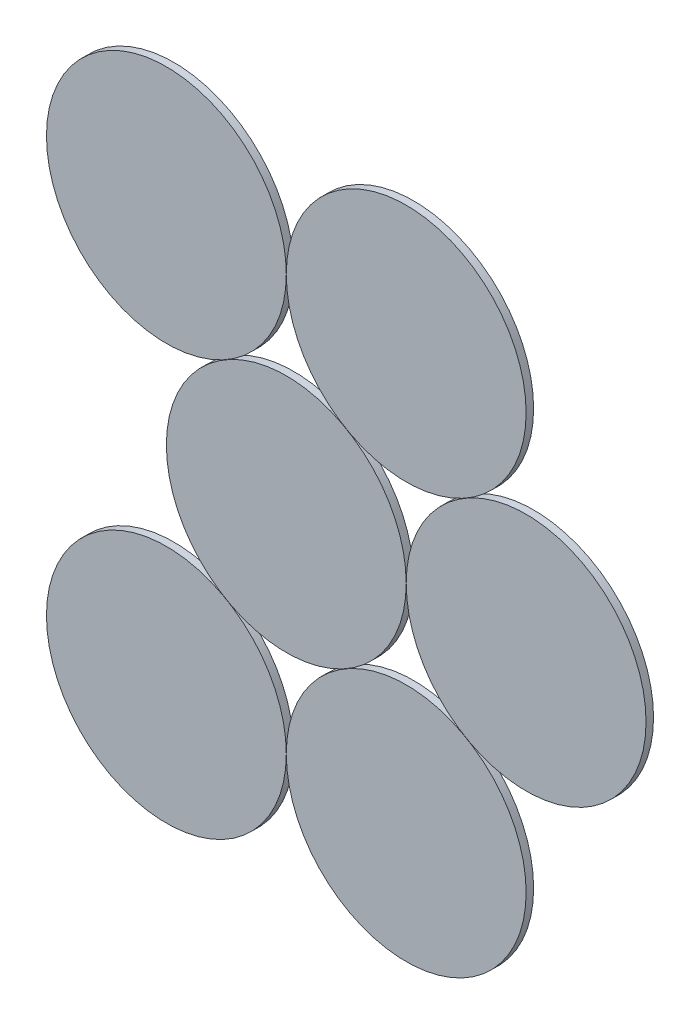
ISO-10303-21;
HEADER;
FILE_DESCRIPTION(('STEP AP214'),'2;1');
FILE_NAME('part.step','',(''),(''),'','','');
FILE_SCHEMA(('AUTOMOTIVE_DESIGN { 1 0 10303 214 1 1 1 1 }'));
ENDSEC;
DATA;
#1=APPLICATION_CONTEXT('core data for automotive mechanical design processes');
#2=APPLICATION_PROTOCOL_DEFINITION('international standard','automotive_design',2000,#1);
#3=PRODUCT_CONTEXT('',#1,'mechanical');
#4=PRODUCT('Part','Part','',(#3));
#5=PRODUCT_RELATED_PRODUCT_CATEGORY('part','',(#4));
#6=PRODUCT_DEFINITION_FORMATION('','',#4);
#7=PRODUCT_DEFINITION_CONTEXT('part definition',#1,'design');
#8=PRODUCT_DEFINITION('design','',#6,#7);
#9=PRODUCT_DEFINITION_SHAPE('','',#8);
#10=(LENGTH_UNIT() NAMED_UNIT(*) SI_UNIT(.MILLI.,.METRE.));
#11=(NAMED_UNIT(*) PLANE_ANGLE_UNIT() SI_UNIT($,.RADIAN.));
#12=(NAMED_UNIT(*) SI_UNIT($,.STERADIAN.) SOLID_ANGLE_UNIT());
#13=UNCERTAINTY_MEASURE_WITH_UNIT(LENGTH_MEASURE(1.E-05),#10,'distance_accuracy_value','');
#14=(GEOMETRIC_REPRESENTATION_CONTEXT(3) GLOBAL_UNCERTAINTY_ASSIGNED_CONTEXT((#13)) GLOBAL_UNIT_ASSIGNED_CONTEXT((#10,
#11,#12)) REPRESENTATION_CONTEXT('',''));
#15=CARTESIAN_POINT('',(0.,0.,0.));
#16=DIRECTION('',(0.,0.,1.));
#17=DIRECTION('',(1.,0.,0.));
#18=AXIS2_PLACEMENT_3D('',#15,#16,#17);
#19=CARTESIAN_POINT('',(152.4,-87.988181024499,3.175));
#20=DIRECTION('',(0.,0.,-1.));
#21=DIRECTION('',(-1.,0.,0.));
#22=AXIS2_PLACEMENT_3D('',#19,#20,#21);
#23=CYLINDRICAL_SURFACE('',#22,50.8);
#24=CARTESIAN_POINT('',(152.4,-87.988181024499,3.175));
#25=DIRECTION('',(0.,0.,1.));
#26=DIRECTION('',(1.,0.,0.));
#27=AXIS2_PLACEMENT_3D('',#24,#25,#26);
#28=CIRCLE('',#27,50.8);
#29=CARTESIAN_POINT('',(203.2,-87.988181024499,3.175));
#30=VERTEX_POINT('',#29);
#31=EDGE_CURVE('E12',#30,#30,#28,.T.);
#32=ORIENTED_EDGE('',*,*,#31,.F.);
#33=EDGE_LOOP('',(#32));
#34=FACE_BOUND('',#33,.T.);
#35=CARTESIAN_POINT('',(152.4,-87.988181024499,0.));
#36=DIRECTION('',(0.,0.,1.));
#37=DIRECTION('',(1.,0.,0.));
#38=AXIS2_PLACEMENT_3D('',#35,#36,#37);
#39=CIRCLE('',#38,50.8);
#40=CARTESIAN_POINT('',(203.2,-87.988181024499,0.));
#41=VERTEX_POINT('',#40);
#42=EDGE_CURVE('E52',#41,#41,#39,.T.);
#43=ORIENTED_EDGE('',*,*,#42,.T.);
#44=EDGE_LOOP('',(#43));
#45=FACE_BOUND('',#44,.T.);
#46=ADVANCED_FACE('F49',(#34,#45),#23,.T.);
#47=CARTESIAN_POINT('',(152.4,-87.988181024499,3.175));
#48=DIRECTION('',(0.,0.,1.));
#49=DIRECTION('',(1.,0.,0.));
#50=AXIS2_PLACEMENT_3D('',#47,#48,#49);
#51=PLANE('',#50);
#52=ORIENTED_EDGE('',*,*,#31,.T.);
#53=EDGE_LOOP('',(#52));
#54=FACE_BOUND('',#53,.T.);
#55=ADVANCED_FACE('F65',(#54),#51,.T.);
#56=CARTESIAN_POINT('',(152.4,-87.988181024499,0.));
#57=DIRECTION('',(0.,0.,1.));
#58=DIRECTION('',(1.,0.,0.));
#59=AXIS2_PLACEMENT_3D('',#56,#57,#58);
#60=PLANE('',#59);
#61=ORIENTED_EDGE('',*,*,#42,.F.);
#62=EDGE_LOOP('',(#61));
#63=FACE_BOUND('',#62,.T.);
#64=ADVANCED_FACE('F63',(#63),#60,.F.);
#65=CLOSED_SHELL('',(#46,#55,#64));
#66=MANIFOLD_SOLID_BREP('B2',#65);
#67=CARTESIAN_POINT('',(101.6,-175.976362048998,3.175));
#68=DIRECTION('',(0.,0.,-1.));
#69=DIRECTION('',(-1.,0.,0.));
#70=AXIS2_PLACEMENT_3D('',#67,#68,#69);
#71=CYLINDRICAL_SURFACE('',#70,50.8);
#72=CARTESIAN_POINT('',(101.6,-175.976362048998,3.175));
#73=DIRECTION('',(0.,0.,1.));
#74=DIRECTION('',(1.,0.,0.));
#75=AXIS2_PLACEMENT_3D('',#72,#73,#74);
#76=CIRCLE('',#75,50.8);
#77=CARTESIAN_POINT('',(152.4,-175.976362048998,3.175));
#78=VERTEX_POINT('',#77);
#79=EDGE_CURVE('E48',#78,#78,#76,.T.);
#80=ORIENTED_EDGE('',*,*,#79,.F.);
#81=EDGE_LOOP('',(#80));
#82=FACE_BOUND('',#81,.T.);
#83=CARTESIAN_POINT('',(101.6,-175.976362048998,0.));
#84=DIRECTION('',(0.,0.,1.));
#85=DIRECTION('',(1.,0.,0.));
#86=AXIS2_PLACEMENT_3D('',#83,#84,#85);
#87=CIRCLE('',#86,50.8);
#88=CARTESIAN_POINT('',(152.4,-175.976362048998,0.));
#89=VERTEX_POINT('',#88);
#90=EDGE_CURVE('E104',#89,#89,#87,.T.);
#91=ORIENTED_EDGE('',*,*,#90,.T.);
#92=EDGE_LOOP('',(#91));
#93=FACE_BOUND('',#92,.T.);
#94=ADVANCED_FACE('F101',(#82,#93),#71,.T.);
#95=CARTESIAN_POINT('',(101.6,-175.976362048998,3.175));
#96=DIRECTION('',(0.,0.,1.));
#97=DIRECTION('',(1.,0.,0.));
#98=AXIS2_PLACEMENT_3D('',#95,#96,#97);
#99=PLANE('',#98);
#100=ORIENTED_EDGE('',*,*,#79,.T.);
#101=EDGE_LOOP('',(#100));
#102=FACE_BOUND('',#101,.T.);
#103=ADVANCED_FACE('F117',(#102),#99,.T.);
#104=CARTESIAN_POINT('',(101.6,-175.976362048998,0.));
#105=DIRECTION('',(0.,0.,1.));
#106=DIRECTION('',(1.,0.,0.));
#107=AXIS2_PLACEMENT_3D('',#104,#105,#106);
#108=PLANE('',#107);
#109=ORIENTED_EDGE('',*,*,#90,.F.);
#110=EDGE_LOOP('',(#109));
#111=FACE_BOUND('',#110,.T.);
#112=ADVANCED_FACE('F115',(#111),#108,.F.);
#113=CLOSED_SHELL('',(#94,#103,#112));
#114=MANIFOLD_SOLID_BREP('B7',#113);
#115=CARTESIAN_POINT('',(101.6,0.,3.175));
#116=DIRECTION('',(0.,0.,-1.));
#117=DIRECTION('',(-1.,0.,0.));
#118=AXIS2_PLACEMENT_3D('',#115,#116,#117);
#119=CYLINDRICAL_SURFACE('',#118,50.8);
#120=CARTESIAN_POINT('',(101.6,0.,3.175));
#121=DIRECTION('',(0.,0.,1.));
#122=DIRECTION('',(1.,0.,0.));
#123=AXIS2_PLACEMENT_3D('',#120,#121,#122);
#124=CIRCLE('',#123,50.8);
#125=CARTESIAN_POINT('',(152.4,0.,3.175));
#126=VERTEX_POINT('',#125);
#127=EDGE_CURVE('E100',#126,#126,#124,.T.);
#128=ORIENTED_EDGE('',*,*,#127,.F.);
#129=EDGE_LOOP('',(#128));
#130=FACE_BOUND('',#129,.T.);
#131=CARTESIAN_POINT('',(101.6,0.,0.));
#132=DIRECTION('',(0.,0.,1.));
#133=DIRECTION('',(1.,0.,0.));
#134=AXIS2_PLACEMENT_3D('',#131,#132,#133);
#135=CIRCLE('',#134,50.8);
#136=CARTESIAN_POINT('',(152.4,0.,0.));
#137=VERTEX_POINT('',#136);
#138=EDGE_CURVE('E156',#137,#137,#135,.T.);
#139=ORIENTED_EDGE('',*,*,#138,.T.);
#140=EDGE_LOOP('',(#139));
#141=FACE_BOUND('',#140,.T.);
#142=ADVANCED_FACE('F153',(#130,#141),#119,.T.);
#143=CARTESIAN_POINT('',(101.6,0.,3.175));
#144=DIRECTION('',(0.,0.,1.));
#145=DIRECTION('',(1.,0.,0.));
#146=AXIS2_PLACEMENT_3D('',#143,#144,#145);
#147=PLANE('',#146);
#148=ORIENTED_EDGE('',*,*,#127,.T.);
#149=EDGE_LOOP('',(#148));
#150=FACE_BOUND('',#149,.T.);
#151=ADVANCED_FACE('F170',(#150),#147,.T.);
#152=CARTESIAN_POINT('',(101.6,0.,0.));
#153=DIRECTION('',(0.,0.,1.));
#154=DIRECTION('',(1.,0.,0.));
#155=AXIS2_PLACEMENT_3D('',#152,#153,#154);
#156=PLANE('',#155);
#157=ORIENTED_EDGE('',*,*,#138,.F.);
#158=EDGE_LOOP('',(#157));
#159=FACE_BOUND('',#158,.T.);
#160=ADVANCED_FACE('F168',(#159),#156,.F.);
#161=CLOSED_SHELL('',(#142,#151,#160));
#162=MANIFOLD_SOLID_BREP('B43',#161);
#163=CARTESIAN_POINT('',(50.8000000000002,-87.9881810244991,3.175));
#164=DIRECTION('',(0.,0.,-1.));
#165=DIRECTION('',(-1.,0.,0.));
#166=AXIS2_PLACEMENT_3D('',#163,#164,#165);
#167=CYLINDRICAL_SURFACE('',#166,50.8);
#168=CARTESIAN_POINT('',(50.8000000000002,-87.9881810244991,3.175));
#169=DIRECTION('',(0.,0.,1.));
#170=DIRECTION('',(1.,0.,0.));
#171=AXIS2_PLACEMENT_3D('',#168,#169,#170);
#172=CIRCLE('',#171,50.8);
#173=CARTESIAN_POINT('',(101.6,-87.9881810244991,3.175));
#174=VERTEX_POINT('',#173);
#175=EDGE_CURVE('E152',#174,#174,#172,.T.);
#176=ORIENTED_EDGE('',*,*,#175,.F.);
#177=EDGE_LOOP('',(#176));
#178=FACE_BOUND('',#177,.T.);
#179=CARTESIAN_POINT('',(50.8000000000002,-87.9881810244991,0.));
#180=DIRECTION('',(0.,0.,1.));
#181=DIRECTION('',(1.,0.,0.));
#182=AXIS2_PLACEMENT_3D('',#179,#180,#181);
#183=CIRCLE('',#182,50.8);
#184=CARTESIAN_POINT('',(101.6,-87.9881810244991,0.));
#185=VERTEX_POINT('',#184);
#186=EDGE_CURVE('E209',#185,#185,#183,.T.);
#187=ORIENTED_EDGE('',*,*,#186,.T.);
#188=EDGE_LOOP('',(#187));
#189=FACE_BOUND('',#188,.T.);
#190=ADVANCED_FACE('F206',(#178,#189),#167,.T.);
#191=CARTESIAN_POINT('',(50.8000000000002,-87.9881810244991,3.175));
#192=DIRECTION('',(0.,0.,1.));
#193=DIRECTION('',(1.,0.,0.));
#194=AXIS2_PLACEMENT_3D('',#191,#192,#193);
#195=PLANE('',#194);
#196=ORIENTED_EDGE('',*,*,#175,.T.);
#197=EDGE_LOOP('',(#196));
#198=FACE_BOUND('',#197,.T.);
#199=ADVANCED_FACE('F222',(#198),#195,.T.);
#200=CARTESIAN_POINT('',(50.8000000000002,-87.9881810244991,0.));
#201=DIRECTION('',(0.,0.,1.));
#202=DIRECTION('',(1.,0.,0.));
#203=AXIS2_PLACEMENT_3D('',#200,#201,#202);
#204=PLANE('',#203);
#205=ORIENTED_EDGE('',*,*,#186,.F.);
#206=EDGE_LOOP('',(#205));
#207=FACE_BOUND('',#206,.T.);
#208=ADVANCED_FACE('F220',(#207),#204,.F.);
#209=CLOSED_SHELL('',(#190,#199,#208));
#210=MANIFOLD_SOLID_BREP('B95',#209);
#211=CARTESIAN_POINT('',(4.23272528138341E-13,-175.976362048998,3.175));
#212=DIRECTION('',(0.,0.,-1.));
#213=DIRECTION('',(-1.,0.,0.));
#214=AXIS2_PLACEMENT_3D('',#211,#212,#213);
#215=CYLINDRICAL_SURFACE('',#214,50.8);
#216=CARTESIAN_POINT('',(4.23272528138341E-13,-175.976362048998,3.175));
#217=DIRECTION('',(0.,0.,1.));
#218=DIRECTION('',(1.,0.,0.));
#219=AXIS2_PLACEMENT_3D('',#216,#217,#218);
#220=CIRCLE('',#219,50.8);
#221=CARTESIAN_POINT('',(50.8000000000004,-175.976362048998,3.175));
#222=VERTEX_POINT('',#221);
#223=EDGE_CURVE('E205',#222,#222,#220,.T.);
#224=ORIENTED_EDGE('',*,*,#223,.F.);
#225=EDGE_LOOP('',(#224));
#226=FACE_BOUND('',#225,.T.);
#227=CARTESIAN_POINT('',(4.23272528138341E-13,-175.976362048998,0.));
#228=DIRECTION('',(0.,0.,1.));
#229=DIRECTION('',(1.,0.,0.));
#230=AXIS2_PLACEMENT_3D('',#227,#228,#229);
#231=CIRCLE('',#230,50.8);
#232=CARTESIAN_POINT('',(50.8000000000004,-175.976362048998,0.));
#233=VERTEX_POINT('',#232);
#234=EDGE_CURVE('E260',#233,#233,#231,.T.);
#235=ORIENTED_EDGE('',*,*,#234,.T.);
#236=EDGE_LOOP('',(#235));
#237=FACE_BOUND('',#236,.T.);
#238=ADVANCED_FACE('F257',(#226,#237),#215,.T.);
#239=CARTESIAN_POINT('',(4.23272528138341E-13,-175.976362048998,3.175));
#240=DIRECTION('',(0.,0.,1.));
#241=DIRECTION('',(1.,0.,0.));
#242=AXIS2_PLACEMENT_3D('',#239,#240,#241);
#243=PLANE('',#242);
#244=ORIENTED_EDGE('',*,*,#223,.T.);
#245=EDGE_LOOP('',(#244));
#246=FACE_BOUND('',#245,.T.);
#247=ADVANCED_FACE('F273',(#246),#243,.T.);
#248=CARTESIAN_POINT('',(4.23272528138341E-13,-175.976362048998,0.));
#249=DIRECTION('',(0.,0.,1.));
#250=DIRECTION('',(1.,0.,0.));
#251=AXIS2_PLACEMENT_3D('',#248,#249,#250);
#252=PLANE('',#251);
#253=ORIENTED_EDGE('',*,*,#234,.F.);
#254=EDGE_LOOP('',(#253));
#255=FACE_BOUND('',#254,.T.);
#256=ADVANCED_FACE('F271',(#255),#252,.F.);
#257=CLOSED_SHELL('',(#238,#247,#256));
#258=MANIFOLD_SOLID_BREP('B147',#257);
#259=CARTESIAN_POINT('',(0.,0.,3.175));
#260=DIRECTION('',(0.,0.,-1.));
#261=DIRECTION('',(-1.,0.,0.));
#262=AXIS2_PLACEMENT_3D('',#259,#260,#261);
#263=CYLINDRICAL_SURFACE('',#262,50.8);
#264=CARTESIAN_POINT('',(0.,0.,3.175));
#265=DIRECTION('',(0.,0.,1.));
#266=DIRECTION('',(1.,0.,0.));
#267=AXIS2_PLACEMENT_3D('',#264,#265,#266);
#268=CIRCLE('',#267,50.8);
#269=CARTESIAN_POINT('',(50.8,0.,3.175));
#270=VERTEX_POINT('',#269);
#271=EDGE_CURVE('E256',#270,#270,#268,.T.);
#272=ORIENTED_EDGE('',*,*,#271,.F.);
#273=EDGE_LOOP('',(#272));
#274=FACE_BOUND('',#273,.T.);
#275=CARTESIAN_POINT('',(0.,0.,0.));
#276=DIRECTION('',(0.,0.,1.));
#277=DIRECTION('',(1.,0.,0.));
#278=AXIS2_PLACEMENT_3D('',#275,#276,#277);
#279=CIRCLE('',#278,50.8);
#280=CARTESIAN_POINT('',(50.8,0.,0.));
#281=VERTEX_POINT('',#280);
#282=EDGE_CURVE('E303',#281,#281,#279,.T.);
#283=ORIENTED_EDGE('',*,*,#282,.T.);
#284=EDGE_LOOP('',(#283));
#285=FACE_BOUND('',#284,.T.);
#286=ADVANCED_FACE('F300',(#274,#285),#263,.T.);
#287=CARTESIAN_POINT('',(0.,0.,3.175));
#288=DIRECTION('',(0.,0.,1.));
#289=DIRECTION('',(1.,0.,0.));
#290=AXIS2_PLACEMENT_3D('',#287,#288,#289);
#291=PLANE('',#290);
#292=ORIENTED_EDGE('',*,*,#271,.T.);
#293=EDGE_LOOP('',(#292));
#294=FACE_BOUND('',#293,.T.);
#295=ADVANCED_FACE('F316',(#294),#291,.T.);
#296=CARTESIAN_POINT('',(0.,0.,0.));
#297=DIRECTION('',(0.,0.,1.));
#298=DIRECTION('',(1.,0.,0.));
#299=AXIS2_PLACEMENT_3D('',#296,#297,#298);
#300=PLANE('',#299);
#301=ORIENTED_EDGE('',*,*,#282,.F.);
#302=EDGE_LOOP('',(#301));
#303=FACE_BOUND('',#302,.T.);
#304=ADVANCED_FACE('F314',(#303),#300,.F.);
#305=CLOSED_SHELL('',(#286,#295,#304));
#306=MANIFOLD_SOLID_BREP('B200',#305);
#307=ADVANCED_BREP_SHAPE_REPRESENTATION('',(#18,#66,#114,#162,#210,#258,#306),#14);
#308=SHAPE_DEFINITION_REPRESENTATION(#9,#307);
ENDSEC;
END-ISO-10303-21;
